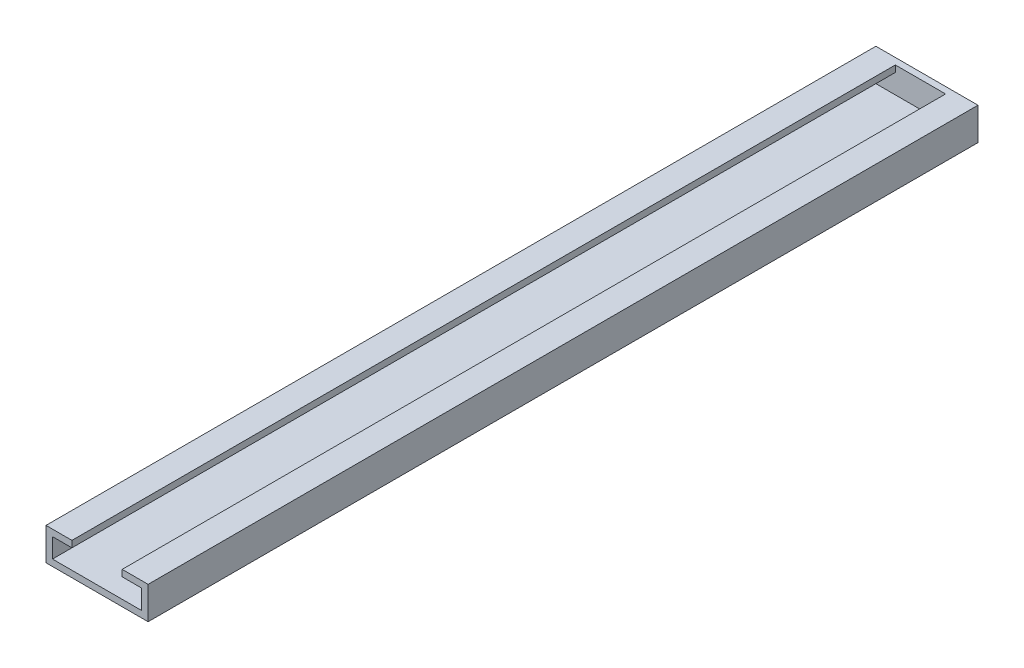
ISO-10303-21;
HEADER;
FILE_DESCRIPTION(('STEP AP214'),'2;1');
FILE_NAME('part.step','',(''),(''),'','','');
FILE_SCHEMA(('AUTOMOTIVE_DESIGN { 1 0 10303 214 1 1 1 1 }'));
ENDSEC;
DATA;
#1=APPLICATION_CONTEXT('core data for automotive mechanical design processes');
#2=APPLICATION_PROTOCOL_DEFINITION('international standard','automotive_design',2000,#1);
#3=PRODUCT_CONTEXT('',#1,'mechanical');
#4=PRODUCT('Part','Part','',(#3));
#5=PRODUCT_RELATED_PRODUCT_CATEGORY('part','',(#4));
#6=PRODUCT_DEFINITION_FORMATION('','',#4);
#7=PRODUCT_DEFINITION_CONTEXT('part definition',#1,'design');
#8=PRODUCT_DEFINITION('design','',#6,#7);
#9=PRODUCT_DEFINITION_SHAPE('','',#8);
#10=(LENGTH_UNIT() NAMED_UNIT(*) SI_UNIT(.MILLI.,.METRE.));
#11=(NAMED_UNIT(*) PLANE_ANGLE_UNIT() SI_UNIT($,.RADIAN.));
#12=(NAMED_UNIT(*) SI_UNIT($,.STERADIAN.) SOLID_ANGLE_UNIT());
#13=UNCERTAINTY_MEASURE_WITH_UNIT(LENGTH_MEASURE(1.E-05),#10,'distance_accuracy_value','');
#14=(GEOMETRIC_REPRESENTATION_CONTEXT(3) GLOBAL_UNCERTAINTY_ASSIGNED_CONTEXT((#13)) GLOBAL_UNIT_ASSIGNED_CONTEXT((#10,
#11,#12)) REPRESENTATION_CONTEXT('',''));
#15=CARTESIAN_POINT('',(0.,0.,0.));
#16=DIRECTION('',(0.,0.,1.));
#17=DIRECTION('',(1.,0.,0.));
#18=AXIS2_PLACEMENT_3D('',#15,#16,#17);
#19=CARTESIAN_POINT('',(-6.3,-2.59274837762418,101.6));
#20=DIRECTION('',(-1.,0.,0.));
#21=DIRECTION('',(0.,-1.,0.));
#22=AXIS2_PLACEMENT_3D('',#19,#20,#21);
#23=PLANE('',#22);
#24=DIRECTION('',(0.,0.,-1.));
#25=VECTOR('',#24,1.);
#26=CARTESIAN_POINT('',(-6.3,1.40725162237582,101.6));
#27=LINE('',#26,#25);
#28=CARTESIAN_POINT('',(-6.3,1.40725162237582,101.6));
#29=VERTEX_POINT('',#28);
#30=CARTESIAN_POINT('',(-6.3,1.40725162237582,-0.8));
#31=VERTEX_POINT('',#30);
#32=EDGE_CURVE('E11',#29,#31,#27,.T.);
#33=ORIENTED_EDGE('',*,*,#32,.T.);
#34=DIRECTION('',(0.,-1.,0.));
#35=VECTOR('',#34,1.);
#36=CARTESIAN_POINT('',(-6.3,-2.59274837762417,-0.8));
#37=LINE('',#36,#35);
#38=CARTESIAN_POINT('',(-6.3,-2.59274837762417,-0.8));
#39=VERTEX_POINT('',#38);
#40=EDGE_CURVE('E121',#31,#39,#37,.T.);
#41=ORIENTED_EDGE('',*,*,#40,.T.);
#42=DIRECTION('',(0.,0.,-1.));
#43=VECTOR('',#42,1.);
#44=CARTESIAN_POINT('',(-6.3,-2.59274837762418,101.6));
#45=LINE('',#44,#43);
#46=CARTESIAN_POINT('',(-6.3,-2.59274837762418,101.6));
#47=VERTEX_POINT('',#46);
#48=EDGE_CURVE('E45',#47,#39,#45,.T.);
#49=ORIENTED_EDGE('',*,*,#48,.F.);
#50=DIRECTION('',(0.,1.,0.));
#51=VECTOR('',#50,1.);
#52=CARTESIAN_POINT('',(-6.3,-2.59274837762418,101.6));
#53=LINE('',#52,#51);
#54=EDGE_CURVE('E123',#47,#29,#53,.T.);
#55=ORIENTED_EDGE('',*,*,#54,.T.);
#56=EDGE_LOOP('',(#33,#41,#49,#55));
#57=FACE_BOUND('',#56,.T.);
#58=ADVANCED_FACE('F35',(#57),#23,.T.);
#59=CARTESIAN_POINT('',(-6.3,-2.59274837762418,101.6));
#60=DIRECTION('',(0.,1.,0.));
#61=DIRECTION('',(0.,0.,1.));
#62=AXIS2_PLACEMENT_3D('',#59,#60,#61);
#63=PLANE('',#62);
#64=ORIENTED_EDGE('',*,*,#48,.T.);
#65=DIRECTION('',(-1.,0.,0.));
#66=VECTOR('',#65,1.);
#67=CARTESIAN_POINT('',(10.3792156108742,-2.59274837762417,-0.8));
#68=LINE('',#67,#66);
#69=CARTESIAN_POINT('',(6.3,-2.59274837762417,-0.8));
#70=VERTEX_POINT('',#69);
#71=EDGE_CURVE('E133',#70,#39,#68,.T.);
#72=ORIENTED_EDGE('',*,*,#71,.F.);
#73=DIRECTION('',(0.,0.,-1.));
#74=VECTOR('',#73,1.);
#75=CARTESIAN_POINT('',(6.3,-2.59274837762418,101.6));
#76=LINE('',#75,#74);
#77=CARTESIAN_POINT('',(6.3,-2.59274837762418,101.6));
#78=VERTEX_POINT('',#77);
#79=EDGE_CURVE('E190',#78,#70,#76,.T.);
#80=ORIENTED_EDGE('',*,*,#79,.F.);
#81=DIRECTION('',(1.,0.,0.));
#82=VECTOR('',#81,1.);
#83=CARTESIAN_POINT('',(-6.3,-2.59274837762418,101.6));
#84=LINE('',#83,#82);
#85=EDGE_CURVE('E169',#47,#78,#84,.T.);
#86=ORIENTED_EDGE('',*,*,#85,.F.);
#87=EDGE_LOOP('',(#64,#72,#80,#86));
#88=FACE_BOUND('',#87,.T.);
#89=ADVANCED_FACE('F240',(#88),#63,.F.);
#90=CARTESIAN_POINT('',(6.3,-2.59274837762418,101.6));
#91=DIRECTION('',(-1.,0.,0.));
#92=DIRECTION('',(0.,-1.,0.));
#93=AXIS2_PLACEMENT_3D('',#90,#91,#92);
#94=PLANE('',#93);
#95=ORIENTED_EDGE('',*,*,#79,.T.);
#96=DIRECTION('',(0.,1.,0.));
#97=VECTOR('',#96,1.);
#98=CARTESIAN_POINT('',(6.3,-2.59274837762417,-0.8));
#99=LINE('',#98,#97);
#100=CARTESIAN_POINT('',(6.3,1.40725162237583,-0.8));
#101=VERTEX_POINT('',#100);
#102=EDGE_CURVE('E143',#70,#101,#99,.T.);
#103=ORIENTED_EDGE('',*,*,#102,.T.);
#104=DIRECTION('',(0.,0.,-1.));
#105=VECTOR('',#104,1.);
#106=CARTESIAN_POINT('',(6.3,1.40725162237583,101.6));
#107=LINE('',#106,#105);
#108=CARTESIAN_POINT('',(6.3,1.40725162237583,101.6));
#109=VERTEX_POINT('',#108);
#110=EDGE_CURVE('E129',#109,#101,#107,.T.);
#111=ORIENTED_EDGE('',*,*,#110,.F.);
#112=DIRECTION('',(0.,1.,0.));
#113=VECTOR('',#112,1.);
#114=CARTESIAN_POINT('',(6.3,-2.59274837762418,101.6));
#115=LINE('',#114,#113);
#116=EDGE_CURVE('E167',#78,#109,#115,.T.);
#117=ORIENTED_EDGE('',*,*,#116,.F.);
#118=EDGE_LOOP('',(#95,#103,#111,#117));
#119=FACE_BOUND('',#118,.T.);
#120=ADVANCED_FACE('F238',(#119),#94,.F.);
#121=CARTESIAN_POINT('',(3.1,1.40725162237582,101.6));
#122=DIRECTION('',(0.,1.,0.));
#123=DIRECTION('',(-1.,0.,0.));
#124=AXIS2_PLACEMENT_3D('',#121,#122,#123);
#125=PLANE('',#124);
#126=ORIENTED_EDGE('',*,*,#110,.T.);
#127=DIRECTION('',(-1.,0.,0.));
#128=VECTOR('',#127,1.);
#129=CARTESIAN_POINT('',(10.3792156108742,1.40725162237583,-0.8));
#130=LINE('',#129,#128);
#131=EDGE_CURVE('E125',#101,#31,#130,.T.);
#132=ORIENTED_EDGE('',*,*,#131,.T.);
#133=ORIENTED_EDGE('',*,*,#32,.F.);
#134=DIRECTION('',(1.,0.,0.));
#135=VECTOR('',#134,1.);
#136=CARTESIAN_POINT('',(-6.3,1.40725162237582,101.6));
#137=LINE('',#136,#135);
#138=CARTESIAN_POINT('',(-3.1,1.40725162237582,101.6));
#139=VERTEX_POINT('',#138);
#140=EDGE_CURVE('E145',#29,#139,#137,.T.);
#141=ORIENTED_EDGE('',*,*,#140,.T.);
#142=DIRECTION('',(0.,0.,-1.));
#143=VECTOR('',#142,1.);
#144=CARTESIAN_POINT('',(-3.1,1.40725162237582,101.6));
#145=LINE('',#144,#143);
#146=CARTESIAN_POINT('',(-3.1,1.40725162237582,0.));
#147=VERTEX_POINT('',#146);
#148=EDGE_CURVE('E39',#139,#147,#145,.T.);
#149=ORIENTED_EDGE('',*,*,#148,.T.);
#150=DIRECTION('',(-1.,0.,0.));
#151=VECTOR('',#150,1.);
#152=CARTESIAN_POINT('',(10.3792156108742,1.40725162237583,0.));
#153=LINE('',#152,#151);
#154=CARTESIAN_POINT('',(3.1,1.40725162237583,0.));
#155=VERTEX_POINT('',#154);
#156=EDGE_CURVE('E134',#155,#147,#153,.T.);
#157=ORIENTED_EDGE('',*,*,#156,.F.);
#158=DIRECTION('',(0.,0.,-1.));
#159=VECTOR('',#158,1.);
#160=CARTESIAN_POINT('',(3.1,1.40725162237582,101.6));
#161=LINE('',#160,#159);
#162=CARTESIAN_POINT('',(3.1,1.40725162237582,101.6));
#163=VERTEX_POINT('',#162);
#164=EDGE_CURVE('E193',#163,#155,#161,.T.);
#165=ORIENTED_EDGE('',*,*,#164,.F.);
#166=DIRECTION('',(1.,0.,0.));
#167=VECTOR('',#166,1.);
#168=CARTESIAN_POINT('',(3.1,1.40725162237582,101.6));
#169=LINE('',#168,#167);
#170=EDGE_CURVE('E165',#163,#109,#169,.T.);
#171=ORIENTED_EDGE('',*,*,#170,.T.);
#172=EDGE_LOOP('',(#126,#132,#133,#141,#149,#157,#165,#171));
#173=FACE_BOUND('',#172,.T.);
#174=ADVANCED_FACE('F126',(#173),#125,.T.);
#175=CARTESIAN_POINT('',(3.1,1.40725162237582,101.6));
#176=DIRECTION('',(1.,0.,0.));
#177=DIRECTION('',(0.,0.,-1.));
#178=AXIS2_PLACEMENT_3D('',#175,#176,#177);
#179=PLANE('',#178);
#180=DIRECTION('',(0.,-1.,0.));
#181=VECTOR('',#180,1.);
#182=CARTESIAN_POINT('',(3.1,1.40725162237582,0.));
#183=LINE('',#182,#181);
#184=CARTESIAN_POINT('',(3.1,0.607251622375822,0.));
#185=VERTEX_POINT('',#184);
#186=EDGE_CURVE('E148',#155,#185,#183,.T.);
#187=ORIENTED_EDGE('',*,*,#186,.T.);
#188=DIRECTION('',(0.,0.,-1.));
#189=VECTOR('',#188,1.);
#190=CARTESIAN_POINT('',(3.1,0.607251622375822,101.6));
#191=LINE('',#190,#189);
#192=CARTESIAN_POINT('',(3.1,0.607251622375822,101.6));
#193=VERTEX_POINT('',#192);
#194=EDGE_CURVE('E196',#193,#185,#191,.T.);
#195=ORIENTED_EDGE('',*,*,#194,.F.);
#196=DIRECTION('',(0.,-1.,0.));
#197=VECTOR('',#196,1.);
#198=CARTESIAN_POINT('',(3.1,1.40725162237582,101.6));
#199=LINE('',#198,#197);
#200=EDGE_CURVE('E163',#163,#193,#199,.T.);
#201=ORIENTED_EDGE('',*,*,#200,.F.);
#202=ORIENTED_EDGE('',*,*,#164,.T.);
#203=EDGE_LOOP('',(#187,#195,#201,#202));
#204=FACE_BOUND('',#203,.T.);
#205=ADVANCED_FACE('F223',(#204),#179,.F.);
#206=CARTESIAN_POINT('',(3.1,0.607251622375822,101.6));
#207=DIRECTION('',(0.,1.,0.));
#208=DIRECTION('',(-1.,0.,0.));
#209=AXIS2_PLACEMENT_3D('',#206,#207,#208);
#210=PLANE('',#209);
#211=DIRECTION('',(1.,0.,0.));
#212=VECTOR('',#211,1.);
#213=CARTESIAN_POINT('',(3.1,0.607251622375822,0.));
#214=LINE('',#213,#212);
#215=CARTESIAN_POINT('',(5.5,0.607251622375821,0.));
#216=VERTEX_POINT('',#215);
#217=EDGE_CURVE('E184',#185,#216,#214,.T.);
#218=ORIENTED_EDGE('',*,*,#217,.T.);
#219=DIRECTION('',(0.,0.,-1.));
#220=VECTOR('',#219,1.);
#221=CARTESIAN_POINT('',(5.5,0.607251622375821,101.6));
#222=LINE('',#221,#220);
#223=CARTESIAN_POINT('',(5.5,0.607251622375821,101.6));
#224=VERTEX_POINT('',#223);
#225=EDGE_CURVE('E199',#224,#216,#222,.T.);
#226=ORIENTED_EDGE('',*,*,#225,.F.);
#227=DIRECTION('',(1.,0.,0.));
#228=VECTOR('',#227,1.);
#229=CARTESIAN_POINT('',(3.1,0.607251622375822,101.6));
#230=LINE('',#229,#228);
#231=EDGE_CURVE('E161',#193,#224,#230,.T.);
#232=ORIENTED_EDGE('',*,*,#231,.F.);
#233=ORIENTED_EDGE('',*,*,#194,.T.);
#234=EDGE_LOOP('',(#218,#226,#232,#233));
#235=FACE_BOUND('',#234,.T.);
#236=ADVANCED_FACE('F227',(#235),#210,.F.);
#237=CARTESIAN_POINT('',(5.5,0.607251622375821,101.6));
#238=DIRECTION('',(1.,0.,0.));
#239=DIRECTION('',(0.,0.,-1.));
#240=AXIS2_PLACEMENT_3D('',#237,#238,#239);
#241=PLANE('',#240);
#242=DIRECTION('',(0.,-1.,0.));
#243=VECTOR('',#242,1.);
#244=CARTESIAN_POINT('',(5.5,0.607251622375821,0.));
#245=LINE('',#244,#243);
#246=CARTESIAN_POINT('',(5.5,-1.79274837762418,0.));
#247=VERTEX_POINT('',#246);
#248=EDGE_CURVE('E181',#216,#247,#245,.T.);
#249=ORIENTED_EDGE('',*,*,#248,.T.);
#250=DIRECTION('',(0.,0.,-1.));
#251=VECTOR('',#250,1.);
#252=CARTESIAN_POINT('',(5.5,-1.79274837762418,101.6));
#253=LINE('',#252,#251);
#254=CARTESIAN_POINT('',(5.5,-1.79274837762418,101.6));
#255=VERTEX_POINT('',#254);
#256=EDGE_CURVE('E202',#255,#247,#253,.T.);
#257=ORIENTED_EDGE('',*,*,#256,.F.);
#258=DIRECTION('',(0.,-1.,0.));
#259=VECTOR('',#258,1.);
#260=CARTESIAN_POINT('',(5.5,0.607251622375821,101.6));
#261=LINE('',#260,#259);
#262=EDGE_CURVE('E159',#224,#255,#261,.T.);
#263=ORIENTED_EDGE('',*,*,#262,.F.);
#264=ORIENTED_EDGE('',*,*,#225,.T.);
#265=EDGE_LOOP('',(#249,#257,#263,#264));
#266=FACE_BOUND('',#265,.T.);
#267=ADVANCED_FACE('F251',(#266),#241,.F.);
#268=CARTESIAN_POINT('',(5.5,-1.79274837762418,101.6));
#269=DIRECTION('',(0.,-1.,0.));
#270=DIRECTION('',(0.,0.,-1.));
#271=AXIS2_PLACEMENT_3D('',#268,#269,#270);
#272=PLANE('',#271);
#273=DIRECTION('',(-1.,0.,0.));
#274=VECTOR('',#273,1.);
#275=CARTESIAN_POINT('',(5.5,-1.79274837762418,0.));
#276=LINE('',#275,#274);
#277=CARTESIAN_POINT('',(-5.5,-1.79274837762418,0.));
#278=VERTEX_POINT('',#277);
#279=EDGE_CURVE('E178',#247,#278,#276,.T.);
#280=ORIENTED_EDGE('',*,*,#279,.T.);
#281=DIRECTION('',(0.,0.,-1.));
#282=VECTOR('',#281,1.);
#283=CARTESIAN_POINT('',(-5.5,-1.79274837762418,101.6));
#284=LINE('',#283,#282);
#285=CARTESIAN_POINT('',(-5.5,-1.79274837762418,101.6));
#286=VERTEX_POINT('',#285);
#287=EDGE_CURVE('E205',#286,#278,#284,.T.);
#288=ORIENTED_EDGE('',*,*,#287,.F.);
#289=DIRECTION('',(-1.,0.,0.));
#290=VECTOR('',#289,1.);
#291=CARTESIAN_POINT('',(5.5,-1.79274837762418,101.6));
#292=LINE('',#291,#290);
#293=EDGE_CURVE('E157',#255,#286,#292,.T.);
#294=ORIENTED_EDGE('',*,*,#293,.F.);
#295=ORIENTED_EDGE('',*,*,#256,.T.);
#296=EDGE_LOOP('',(#280,#288,#294,#295));
#297=FACE_BOUND('',#296,.T.);
#298=ADVANCED_FACE('F253',(#297),#272,.F.);
#299=CARTESIAN_POINT('',(-5.5,0.607251622375821,101.6));
#300=DIRECTION('',(1.,0.,0.));
#301=DIRECTION('',(0.,0.,-1.));
#302=AXIS2_PLACEMENT_3D('',#299,#300,#301);
#303=PLANE('',#302);
#304=DIRECTION('',(0.,-1.,0.));
#305=VECTOR('',#304,1.);
#306=CARTESIAN_POINT('',(-5.5,0.607251622375821,0.));
#307=LINE('',#306,#305);
#308=CARTESIAN_POINT('',(-5.5,0.607251622375821,0.));
#309=VERTEX_POINT('',#308);
#310=EDGE_CURVE('E176',#309,#278,#307,.T.);
#311=ORIENTED_EDGE('',*,*,#310,.F.);
#312=DIRECTION('',(0.,0.,-1.));
#313=VECTOR('',#312,1.);
#314=CARTESIAN_POINT('',(-5.5,0.607251622375821,101.6));
#315=LINE('',#314,#313);
#316=CARTESIAN_POINT('',(-5.5,0.607251622375821,101.6));
#317=VERTEX_POINT('',#316);
#318=EDGE_CURVE('E208',#317,#309,#315,.T.);
#319=ORIENTED_EDGE('',*,*,#318,.F.);
#320=DIRECTION('',(0.,-1.,0.));
#321=VECTOR('',#320,1.);
#322=CARTESIAN_POINT('',(-5.5,0.607251622375821,101.6));
#323=LINE('',#322,#321);
#324=EDGE_CURVE('E154',#317,#286,#323,.T.);
#325=ORIENTED_EDGE('',*,*,#324,.T.);
#326=ORIENTED_EDGE('',*,*,#287,.T.);
#327=EDGE_LOOP('',(#311,#319,#325,#326));
#328=FACE_BOUND('',#327,.T.);
#329=ADVANCED_FACE('F247',(#328),#303,.T.);
#330=CARTESIAN_POINT('',(-3.1,0.607251622375822,101.6));
#331=DIRECTION('',(0.,-1.,0.));
#332=DIRECTION('',(1.,0.,0.));
#333=AXIS2_PLACEMENT_3D('',#330,#331,#332);
#334=PLANE('',#333);
#335=DIRECTION('',(-1.,0.,0.));
#336=VECTOR('',#335,1.);
#337=CARTESIAN_POINT('',(-3.1,0.607251622375822,0.));
#338=LINE('',#337,#336);
#339=CARTESIAN_POINT('',(-3.1,0.607251622375822,0.));
#340=VERTEX_POINT('',#339);
#341=EDGE_CURVE('E174',#340,#309,#338,.T.);
#342=ORIENTED_EDGE('',*,*,#341,.F.);
#343=DIRECTION('',(0.,0.,-1.));
#344=VECTOR('',#343,1.);
#345=CARTESIAN_POINT('',(-3.1,0.607251622375822,101.6));
#346=LINE('',#345,#344);
#347=CARTESIAN_POINT('',(-3.1,0.607251622375822,101.6));
#348=VERTEX_POINT('',#347);
#349=EDGE_CURVE('E210',#348,#340,#346,.T.);
#350=ORIENTED_EDGE('',*,*,#349,.F.);
#351=DIRECTION('',(-1.,0.,0.));
#352=VECTOR('',#351,1.);
#353=CARTESIAN_POINT('',(-3.1,0.607251622375822,101.6));
#354=LINE('',#353,#352);
#355=EDGE_CURVE('E151',#348,#317,#354,.T.);
#356=ORIENTED_EDGE('',*,*,#355,.T.);
#357=ORIENTED_EDGE('',*,*,#318,.T.);
#358=EDGE_LOOP('',(#342,#350,#356,#357));
#359=FACE_BOUND('',#358,.T.);
#360=ADVANCED_FACE('F244',(#359),#334,.T.);
#361=CARTESIAN_POINT('',(-3.1,1.40725162237582,101.6));
#362=DIRECTION('',(1.,0.,0.));
#363=DIRECTION('',(0.,0.,-1.));
#364=AXIS2_PLACEMENT_3D('',#361,#362,#363);
#365=PLANE('',#364);
#366=DIRECTION('',(0.,-1.,0.));
#367=VECTOR('',#366,1.);
#368=CARTESIAN_POINT('',(-3.1,1.40725162237582,0.));
#369=LINE('',#368,#367);
#370=EDGE_CURVE('E172',#147,#340,#369,.T.);
#371=ORIENTED_EDGE('',*,*,#370,.F.);
#372=ORIENTED_EDGE('',*,*,#148,.F.);
#373=DIRECTION('',(0.,-1.,0.));
#374=VECTOR('',#373,1.);
#375=CARTESIAN_POINT('',(-3.1,1.40725162237582,101.6));
#376=LINE('',#375,#374);
#377=EDGE_CURVE('E147',#139,#348,#376,.T.);
#378=ORIENTED_EDGE('',*,*,#377,.T.);
#379=ORIENTED_EDGE('',*,*,#349,.T.);
#380=EDGE_LOOP('',(#371,#372,#378,#379));
#381=FACE_BOUND('',#380,.T.);
#382=ADVANCED_FACE('F37',(#381),#365,.T.);
#383=CARTESIAN_POINT('',(0.,0.,101.6));
#384=DIRECTION('',(0.,0.,-1.));
#385=DIRECTION('',(-1.,0.,0.));
#386=AXIS2_PLACEMENT_3D('',#383,#384,#385);
#387=PLANE('',#386);
#388=ORIENTED_EDGE('',*,*,#140,.F.);
#389=ORIENTED_EDGE('',*,*,#54,.F.);
#390=ORIENTED_EDGE('',*,*,#85,.T.);
#391=ORIENTED_EDGE('',*,*,#116,.T.);
#392=ORIENTED_EDGE('',*,*,#170,.F.);
#393=ORIENTED_EDGE('',*,*,#200,.T.);
#394=ORIENTED_EDGE('',*,*,#231,.T.);
#395=ORIENTED_EDGE('',*,*,#262,.T.);
#396=ORIENTED_EDGE('',*,*,#293,.T.);
#397=ORIENTED_EDGE('',*,*,#324,.F.);
#398=ORIENTED_EDGE('',*,*,#355,.F.);
#399=ORIENTED_EDGE('',*,*,#377,.F.);
#400=EDGE_LOOP('',(#388,#389,#390,#391,#392,#393,#394,#395,#396,#397,#398,#399));
#401=FACE_BOUND('',#400,.T.);
#402=ADVANCED_FACE('F231',(#401),#387,.F.);
#403=CARTESIAN_POINT('',(10.3792156108742,-2.59274837762417,0.));
#404=DIRECTION('',(0.,0.,1.));
#405=DIRECTION('',(1.,0.,0.));
#406=AXIS2_PLACEMENT_3D('',#403,#404,#405);
#407=PLANE('',#406);
#408=ORIENTED_EDGE('',*,*,#156,.T.);
#409=ORIENTED_EDGE('',*,*,#370,.T.);
#410=ORIENTED_EDGE('',*,*,#341,.T.);
#411=ORIENTED_EDGE('',*,*,#310,.T.);
#412=ORIENTED_EDGE('',*,*,#279,.F.);
#413=ORIENTED_EDGE('',*,*,#248,.F.);
#414=ORIENTED_EDGE('',*,*,#217,.F.);
#415=ORIENTED_EDGE('',*,*,#186,.F.);
#416=EDGE_LOOP('',(#408,#409,#410,#411,#412,#413,#414,#415));
#417=FACE_BOUND('',#416,.T.);
#418=ADVANCED_FACE('F219',(#417),#407,.T.);
#419=CARTESIAN_POINT('',(10.3792156108742,-2.59274837762417,-0.8));
#420=DIRECTION('',(0.,0.,-1.));
#421=DIRECTION('',(-1.,0.,0.));
#422=AXIS2_PLACEMENT_3D('',#419,#420,#421);
#423=PLANE('',#422);
#424=ORIENTED_EDGE('',*,*,#102,.F.);
#425=ORIENTED_EDGE('',*,*,#71,.T.);
#426=ORIENTED_EDGE('',*,*,#40,.F.);
#427=ORIENTED_EDGE('',*,*,#131,.F.);
#428=EDGE_LOOP('',(#424,#425,#426,#427));
#429=FACE_BOUND('',#428,.T.);
#430=ADVANCED_FACE('F137',(#429),#423,.T.);
#431=CLOSED_SHELL('',(#58,#89,#120,#174,#205,#236,#267,#298,#329,#360,#382,#402,#418,#430));
#432=MANIFOLD_SOLID_BREP('B2',#431);
#433=ADVANCED_BREP_SHAPE_REPRESENTATION('',(#18,#432),#14);
#434=SHAPE_DEFINITION_REPRESENTATION(#9,#433);
ENDSEC;
END-ISO-10303-21;
